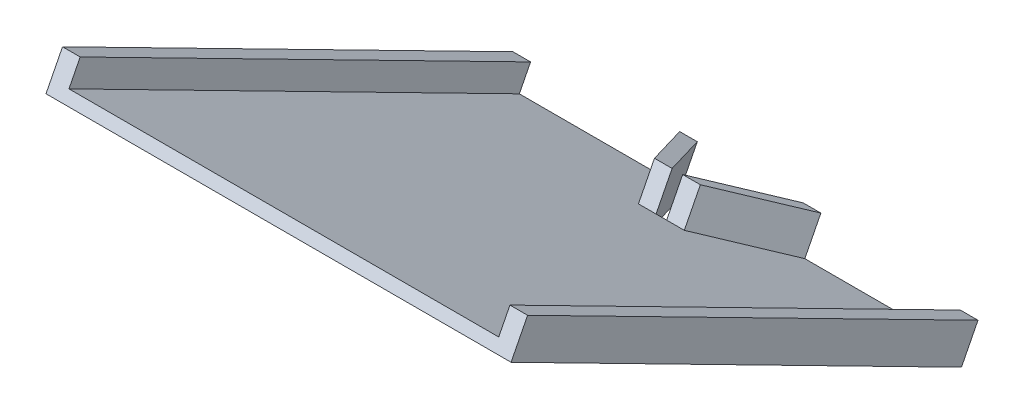
ISO-10303-21;
HEADER;
FILE_DESCRIPTION(('STEP AP214'),'2;1');
FILE_NAME('part.step','',(''),(''),'','','');
FILE_SCHEMA(('AUTOMOTIVE_DESIGN { 1 0 10303 214 1 1 1 1 }'));
ENDSEC;
DATA;
#1=APPLICATION_CONTEXT('core data for automotive mechanical design processes');
#2=APPLICATION_PROTOCOL_DEFINITION('international standard','automotive_design',2000,#1);
#3=PRODUCT_CONTEXT('',#1,'mechanical');
#4=PRODUCT('Part','Part','',(#3));
#5=PRODUCT_RELATED_PRODUCT_CATEGORY('part','',(#4));
#6=PRODUCT_DEFINITION_FORMATION('','',#4);
#7=PRODUCT_DEFINITION_CONTEXT('part definition',#1,'design');
#8=PRODUCT_DEFINITION('design','',#6,#7);
#9=PRODUCT_DEFINITION_SHAPE('','',#8);
#10=(LENGTH_UNIT() NAMED_UNIT(*) SI_UNIT(.MILLI.,.METRE.));
#11=(NAMED_UNIT(*) PLANE_ANGLE_UNIT() SI_UNIT($,.RADIAN.));
#12=(NAMED_UNIT(*) SI_UNIT($,.STERADIAN.) SOLID_ANGLE_UNIT());
#13=UNCERTAINTY_MEASURE_WITH_UNIT(LENGTH_MEASURE(1.E-05),#10,'distance_accuracy_value','');
#14=(GEOMETRIC_REPRESENTATION_CONTEXT(3) GLOBAL_UNCERTAINTY_ASSIGNED_CONTEXT((#13)) GLOBAL_UNIT_ASSIGNED_CONTEXT((#10,
#11,#12)) REPRESENTATION_CONTEXT('',''));
#15=CARTESIAN_POINT('',(0.,0.,0.));
#16=DIRECTION('',(0.,0.,1.));
#17=DIRECTION('',(1.,0.,0.));
#18=AXIS2_PLACEMENT_3D('',#15,#16,#17);
#19=CARTESIAN_POINT('',(1317.1,29.492315950635,-15.027085541379));
#20=DIRECTION('',(0.,-0.891006524188367,0.453990499739548));
#21=DIRECTION('',(0.,-0.453990499739548,-0.891006524188368));
#22=AXIS2_PLACEMENT_3D('',#19,#20,#21);
#23=PLANE('',#22);
#24=DIRECTION('',(0.503592675263439,0.392221102483988,0.769777256215886));
#25=VECTOR('',#24,1.);
#26=CARTESIAN_POINT('',(965.149085517055,-225.91679291682,-516.295685806353));
#27=LINE('',#26,#25);
#28=CARTESIAN_POINT('',(458.6,-620.440483476501,-1290.59202556945));
#29=VERTEX_POINT('',#28);
#30=CARTESIAN_POINT('',(593.6,-515.296283736822,-1084.23491456742));
#31=VERTEX_POINT('',#30);
#32=EDGE_CURVE('E53',#29,#31,#27,.T.);
#33=ORIENTED_EDGE('',*,*,#32,.F.);
#34=DIRECTION('',(-1.,0.,0.));
#35=VECTOR('',#34,1.);
#36=CARTESIAN_POINT('',(1317.1,-620.440483476501,-1290.59202556945));
#37=LINE('',#36,#35);
#38=CARTESIAN_POINT('',(50.,-620.440483476501,-1290.59202556945));
#39=VERTEX_POINT('',#38);
#40=EDGE_CURVE('E174',#29,#39,#37,.T.);
#41=ORIENTED_EDGE('',*,*,#40,.T.);
#42=DIRECTION('',(0.,-0.453990499739547,-0.891006524188367));
#43=VECTOR('',#42,1.);
#44=CARTESIAN_POINT('',(50.,29.492315950635,-15.027085541379));
#45=LINE('',#44,#43);
#46=CARTESIAN_POINT('',(50.,29.492315950635,-15.027085541379));
#47=VERTEX_POINT('',#46);
#48=EDGE_CURVE('E210',#47,#39,#45,.T.);
#49=ORIENTED_EDGE('',*,*,#48,.F.);
#50=DIRECTION('',(-1.,0.,0.));
#51=VECTOR('',#50,1.);
#52=CARTESIAN_POINT('',(1317.1,29.492315950635,-15.027085541379));
#53=LINE('',#52,#51);
#54=CARTESIAN_POINT('',(1267.1,29.492315950635,-15.027085541379));
#55=VERTEX_POINT('',#54);
#56=EDGE_CURVE('E268',#55,#47,#53,.T.);
#57=ORIENTED_EDGE('',*,*,#56,.F.);
#58=DIRECTION('',(0.,-0.453990499739547,-0.891006524188367));
#59=VECTOR('',#58,1.);
#60=CARTESIAN_POINT('',(1267.1,29.492315950635,-15.027085541379));
#61=LINE('',#60,#59);
#62=CARTESIAN_POINT('',(1267.1,-620.440483476501,-1290.59202556945));
#63=VERTEX_POINT('',#62);
#64=EDGE_CURVE('E207',#55,#63,#61,.T.);
#65=ORIENTED_EDGE('',*,*,#64,.T.);
#66=CARTESIAN_POINT('',(858.5,-620.440483476501,-1290.59202556945));
#67=VERTEX_POINT('',#66);
#68=EDGE_CURVE('E276',#63,#67,#37,.T.);
#69=ORIENTED_EDGE('',*,*,#68,.T.);
#70=DIRECTION('',(-0.503592675263439,0.392221102483988,0.769777256215886));
#71=VECTOR('',#70,1.);
#72=CARTESIAN_POINT('',(17.9270016681605,34.2363700967126,-5.71635503560176));
#73=LINE('',#72,#71);
#74=CARTESIAN_POINT('',(723.5,-515.296283736822,-1084.23491456742));
#75=VERTEX_POINT('',#74);
#76=EDGE_CURVE('E175',#67,#75,#73,.T.);
#77=ORIENTED_EDGE('',*,*,#76,.T.);
#78=DIRECTION('',(1.,0.,0.));
#79=VECTOR('',#78,1.);
#80=CARTESIAN_POINT('',(0.,-515.296283736822,-1084.23491456742));
#81=LINE('',#80,#79);
#82=CARTESIAN_POINT('',(673.5,-515.296283736822,-1084.23491456742));
#83=VERTEX_POINT('',#82);
#84=EDGE_CURVE('E178',#83,#75,#81,.T.);
#85=ORIENTED_EDGE('',*,*,#84,.F.);
#86=DIRECTION('',(1.,0.,0.));
#87=VECTOR('',#86,1.);
#88=CARTESIAN_POINT('',(0.,-515.296283736822,-1084.23491456742));
#89=LINE('',#88,#87);
#90=CARTESIAN_POINT('',(643.5,-515.296283736822,-1084.23491456742));
#91=VERTEX_POINT('',#90);
#92=EDGE_CURVE('E239',#91,#83,#89,.T.);
#93=ORIENTED_EDGE('',*,*,#92,.F.);
#94=DIRECTION('',(1.,0.,0.));
#95=VECTOR('',#94,1.);
#96=CARTESIAN_POINT('',(0.,-515.296283736822,-1084.23491456742));
#97=LINE('',#96,#95);
#98=EDGE_CURVE('E49',#31,#91,#97,.T.);
#99=ORIENTED_EDGE('',*,*,#98,.F.);
#100=EDGE_LOOP('',(#33,#41,#49,#57,#65,#69,#77,#85,#93,#99));
#101=FACE_BOUND('',#100,.T.);
#102=ADVANCED_FACE('F34',(#101),#23,.F.);
#103=CARTESIAN_POINT('',(1317.1,0.,0.));
#104=DIRECTION('',(0.,0.891006524188367,-0.453990499739547));
#105=DIRECTION('',(0.,0.453990499739548,0.891006524188368));
#106=AXIS2_PLACEMENT_3D('',#103,#104,#105);
#107=PLANE('',#106);
#108=DIRECTION('',(-0.503592675263439,-0.392221102483988,-0.769777256215886));
#109=VECTOR('',#108,1.);
#110=CARTESIAN_POINT('',(1336.41807976115,-5.11217760122711,-10.0332134661764));
#111=LINE('',#110,#109);
#112=CARTESIAN_POINT('',(643.5,-544.788599687457,-1069.20782902604));
#113=VERTEX_POINT('',#112);
#114=CARTESIAN_POINT('',(508.5,-649.932799427136,-1275.56494002807));
#115=VERTEX_POINT('',#114);
#116=EDGE_CURVE('E257',#113,#115,#111,.T.);
#117=ORIENTED_EDGE('',*,*,#116,.F.);
#118=DIRECTION('',(1.,0.,0.));
#119=VECTOR('',#118,1.);
#120=CARTESIAN_POINT('',(1317.1,-544.788599687457,-1069.20782902604));
#121=LINE('',#120,#119);
#122=CARTESIAN_POINT('',(673.5,-544.788599687457,-1069.20782902604));
#123=VERTEX_POINT('',#122);
#124=EDGE_CURVE('E245',#113,#123,#121,.T.);
#125=ORIENTED_EDGE('',*,*,#124,.T.);
#126=DIRECTION('',(0.503592675263439,-0.392221102483988,-0.769777256215886));
#127=VECTOR('',#126,1.);
#128=CARTESIAN_POINT('',(314.631193611895,-265.285092582189,-520.651309655709));
#129=LINE('',#128,#127);
#130=CARTESIAN_POINT('',(808.5,-649.932799427136,-1275.56494002807));
#131=VERTEX_POINT('',#130);
#132=EDGE_CURVE('E254',#123,#131,#129,.T.);
#133=ORIENTED_EDGE('',*,*,#132,.T.);
#134=DIRECTION('',(-1.,0.,0.));
#135=VECTOR('',#134,1.);
#136=CARTESIAN_POINT('',(1317.1,-649.932799427136,-1275.56494002807));
#137=LINE('',#136,#135);
#138=CARTESIAN_POINT('',(1317.1,-649.932799427136,-1275.56494002807));
#139=VERTEX_POINT('',#138);
#140=EDGE_CURVE('E42',#139,#131,#137,.T.);
#141=ORIENTED_EDGE('',*,*,#140,.F.);
#142=DIRECTION('',(0.,-0.453990499739547,-0.891006524188367));
#143=VECTOR('',#142,1.);
#144=CARTESIAN_POINT('',(1317.1,0.,0.));
#145=LINE('',#144,#143);
#146=CARTESIAN_POINT('',(1317.1,0.,0.));
#147=VERTEX_POINT('',#146);
#148=EDGE_CURVE('E263',#147,#139,#145,.T.);
#149=ORIENTED_EDGE('',*,*,#148,.F.);
#150=DIRECTION('',(-1.,0.,0.));
#151=VECTOR('',#150,1.);
#152=CARTESIAN_POINT('',(1317.1,0.,0.));
#153=LINE('',#152,#151);
#154=CARTESIAN_POINT('',(0.,0.,0.));
#155=VERTEX_POINT('',#154);
#156=EDGE_CURVE('E11',#147,#155,#153,.T.);
#157=ORIENTED_EDGE('',*,*,#156,.T.);
#158=DIRECTION('',(0.,-0.453990499739547,-0.891006524188367));
#159=VECTOR('',#158,1.);
#160=CARTESIAN_POINT('',(0.,0.,0.));
#161=LINE('',#160,#159);
#162=CARTESIAN_POINT('',(0.,-649.932799427136,-1275.56494002807));
#163=VERTEX_POINT('',#162);
#164=EDGE_CURVE('E271',#155,#163,#161,.T.);
#165=ORIENTED_EDGE('',*,*,#164,.T.);
#166=EDGE_CURVE('E278',#115,#163,#137,.T.);
#167=ORIENTED_EDGE('',*,*,#166,.F.);
#168=EDGE_LOOP('',(#117,#125,#133,#141,#149,#157,#165,#167));
#169=FACE_BOUND('',#168,.T.);
#170=ADVANCED_FACE('F288',(#169),#107,.F.);
#171=CARTESIAN_POINT('',(1317.1,-649.932799427136,-1275.56494002807));
#172=DIRECTION('',(0.,0.453990499739548,0.891006524188367));
#173=DIRECTION('',(0.,-0.891006524188367,0.453990499739548));
#174=AXIS2_PLACEMENT_3D('',#171,#172,#173);
#175=PLANE('',#174);
#176=DIRECTION('',(0.,0.891006524188368,-0.453990499739548));
#177=VECTOR('',#176,1.);
#178=CARTESIAN_POINT('',(508.5,-1165.90965638292,-1012.66160005895));
#179=LINE('',#178,#177);
#180=CARTESIAN_POINT('',(508.5,-531.339831057664,-1335.9910755434));
#181=VERTEX_POINT('',#180);
#182=EDGE_CURVE('E243',#115,#181,#179,.T.);
#183=ORIENTED_EDGE('',*,*,#182,.F.);
#184=ORIENTED_EDGE('',*,*,#166,.T.);
#185=DIRECTION('',(0.,0.891006524188367,-0.453990499739548));
#186=VECTOR('',#185,1.);
#187=CARTESIAN_POINT('',(0.,-649.932799427136,-1275.56494002807));
#188=LINE('',#187,#186);
#189=CARTESIAN_POINT('',(0.,-558.070026783315,-1322.37136055121));
#190=VERTEX_POINT('',#189);
#191=EDGE_CURVE('E264',#163,#190,#188,.T.);
#192=ORIENTED_EDGE('',*,*,#191,.T.);
#193=DIRECTION('',(1.,0.,0.));
#194=VECTOR('',#193,1.);
#195=CARTESIAN_POINT('',(0.,-558.070026783315,-1322.37136055121));
#196=LINE('',#195,#194);
#197=CARTESIAN_POINT('',(50.,-558.070026783315,-1322.37136055121));
#198=VERTEX_POINT('',#197);
#199=EDGE_CURVE('E226',#190,#198,#196,.T.);
#200=ORIENTED_EDGE('',*,*,#199,.T.);
#201=DIRECTION('',(0.,-0.891006524188368,0.453990499739547));
#202=VECTOR('',#201,1.);
#203=CARTESIAN_POINT('',(50.,-558.070026783315,-1322.37136055121));
#204=LINE('',#203,#202);
#205=EDGE_CURVE('E232',#198,#39,#204,.T.);
#206=ORIENTED_EDGE('',*,*,#205,.T.);
#207=ORIENTED_EDGE('',*,*,#40,.F.);
#208=DIRECTION('',(0.,-0.891006524188368,0.453990499739547));
#209=VECTOR('',#208,1.);
#210=CARTESIAN_POINT('',(458.6,-531.339831057664,-1335.9910755434));
#211=LINE('',#210,#209);
#212=CARTESIAN_POINT('',(458.6,-531.339831057664,-1335.9910755434));
#213=VERTEX_POINT('',#212);
#214=EDGE_CURVE('E156',#213,#29,#211,.T.);
#215=ORIENTED_EDGE('',*,*,#214,.F.);
#216=DIRECTION('',(-1.,0.,0.));
#217=VECTOR('',#216,1.);
#218=CARTESIAN_POINT('',(0.,-531.339831057664,-1335.9910755434));
#219=LINE('',#218,#217);
#220=EDGE_CURVE('E162',#181,#213,#219,.T.);
#221=ORIENTED_EDGE('',*,*,#220,.F.);
#222=EDGE_LOOP('',(#183,#184,#192,#200,#206,#207,#215,#221));
#223=FACE_BOUND('',#222,.T.);
#224=ADVANCED_FACE('F172',(#223),#175,.F.);
#225=CARTESIAN_POINT('',(1317.1,0.,0.));
#226=DIRECTION('',(0.,-0.453990499739548,-0.891006524188368));
#227=DIRECTION('',(0.,0.891006524188368,-0.453990499739548));
#228=AXIS2_PLACEMENT_3D('',#225,#226,#227);
#229=PLANE('',#228);
#230=DIRECTION('',(0.,-0.891006524188368,0.453990499739548));
#231=VECTOR('',#230,1.);
#232=CARTESIAN_POINT('',(0.,0.,0.));
#233=LINE('',#232,#231);
#234=CARTESIAN_POINT('',(0.,91.8627726438207,-46.8064205231473));
#235=VERTEX_POINT('',#234);
#236=EDGE_CURVE('E259',#235,#155,#233,.T.);
#237=ORIENTED_EDGE('',*,*,#236,.T.);
#238=ORIENTED_EDGE('',*,*,#156,.F.);
#239=DIRECTION('',(0.,-0.891006524188368,0.453990499739548));
#240=VECTOR('',#239,1.);
#241=CARTESIAN_POINT('',(1317.1,0.,0.));
#242=LINE('',#241,#240);
#243=CARTESIAN_POINT('',(1317.1,91.8627726438207,-46.8064205231473));
#244=VERTEX_POINT('',#243);
#245=EDGE_CURVE('E260',#244,#147,#242,.T.);
#246=ORIENTED_EDGE('',*,*,#245,.F.);
#247=DIRECTION('',(-1.,0.,0.));
#248=VECTOR('',#247,1.);
#249=CARTESIAN_POINT('',(1317.1,91.8627726438207,-46.8064205231473));
#250=LINE('',#249,#248);
#251=CARTESIAN_POINT('',(1267.1,91.8627726438207,-46.8064205231473));
#252=VERTEX_POINT('',#251);
#253=EDGE_CURVE('E211',#244,#252,#250,.T.);
#254=ORIENTED_EDGE('',*,*,#253,.T.);
#255=DIRECTION('',(0.,-0.891006524188368,0.453990499739547));
#256=VECTOR('',#255,1.);
#257=CARTESIAN_POINT('',(1267.1,91.8627726438207,-46.8064205231473));
#258=LINE('',#257,#256);
#259=EDGE_CURVE('E203',#252,#55,#258,.T.);
#260=ORIENTED_EDGE('',*,*,#259,.T.);
#261=ORIENTED_EDGE('',*,*,#56,.T.);
#262=DIRECTION('',(0.,-0.891006524188368,0.453990499739547));
#263=VECTOR('',#262,1.);
#264=CARTESIAN_POINT('',(50.,91.8627726438207,-46.8064205231473));
#265=LINE('',#264,#263);
#266=CARTESIAN_POINT('',(50.,91.8627726438207,-46.8064205231473));
#267=VERTEX_POINT('',#266);
#268=EDGE_CURVE('E236',#267,#47,#265,.T.);
#269=ORIENTED_EDGE('',*,*,#268,.F.);
#270=DIRECTION('',(1.,0.,0.));
#271=VECTOR('',#270,1.);
#272=CARTESIAN_POINT('',(0.,91.8627726438207,-46.8064205231473));
#273=LINE('',#272,#271);
#274=EDGE_CURVE('E221',#235,#267,#273,.T.);
#275=ORIENTED_EDGE('',*,*,#274,.F.);
#276=EDGE_LOOP('',(#237,#238,#246,#254,#260,#261,#269,#275));
#277=FACE_BOUND('',#276,.T.);
#278=ADVANCED_FACE('F36',(#277),#229,.F.);
#279=ORIENTED_EDGE('',*,*,#140,.T.);
#280=DIRECTION('',(0.,0.891006524188368,-0.453990499739548));
#281=VECTOR('',#280,1.);
#282=CARTESIAN_POINT('',(808.5,-1165.90965638292,-1012.66160005895));
#283=LINE('',#282,#281);
#284=CARTESIAN_POINT('',(808.5,-531.339831057665,-1335.9910755434));
#285=VERTEX_POINT('',#284);
#286=EDGE_CURVE('E246',#131,#285,#283,.T.);
#287=ORIENTED_EDGE('',*,*,#286,.T.);
#288=DIRECTION('',(-1.,0.,0.));
#289=VECTOR('',#288,1.);
#290=CARTESIAN_POINT('',(0.,-531.339831057664,-1335.9910755434));
#291=LINE('',#290,#289);
#292=CARTESIAN_POINT('',(858.5,-531.339831057664,-1335.9910755434));
#293=VERTEX_POINT('',#292);
#294=EDGE_CURVE('E187',#293,#285,#291,.T.);
#295=ORIENTED_EDGE('',*,*,#294,.F.);
#296=DIRECTION('',(0.,-0.891006524188368,0.453990499739547));
#297=VECTOR('',#296,1.);
#298=CARTESIAN_POINT('',(858.5,-531.339831057664,-1335.9910755434));
#299=LINE('',#298,#297);
#300=EDGE_CURVE('E200',#293,#67,#299,.T.);
#301=ORIENTED_EDGE('',*,*,#300,.T.);
#302=ORIENTED_EDGE('',*,*,#68,.F.);
#303=DIRECTION('',(0.,-0.891006524188368,0.453990499739547));
#304=VECTOR('',#303,1.);
#305=CARTESIAN_POINT('',(1267.1,-558.070026783315,-1322.37136055121));
#306=LINE('',#305,#304);
#307=CARTESIAN_POINT('',(1267.1,-558.070026783315,-1322.37136055121));
#308=VERTEX_POINT('',#307);
#309=EDGE_CURVE('E202',#308,#63,#306,.T.);
#310=ORIENTED_EDGE('',*,*,#309,.F.);
#311=DIRECTION('',(-1.,0.,0.));
#312=VECTOR('',#311,1.);
#313=CARTESIAN_POINT('',(1317.1,-558.070026783315,-1322.37136055121));
#314=LINE('',#313,#312);
#315=CARTESIAN_POINT('',(1317.1,-558.070026783315,-1322.37136055121));
#316=VERTEX_POINT('',#315);
#317=EDGE_CURVE('E214',#316,#308,#314,.T.);
#318=ORIENTED_EDGE('',*,*,#317,.F.);
#319=DIRECTION('',(0.,0.891006524188367,-0.453990499739548));
#320=VECTOR('',#319,1.);
#321=CARTESIAN_POINT('',(1317.1,-649.932799427136,-1275.56494002807));
#322=LINE('',#321,#320);
#323=EDGE_CURVE('E266',#139,#316,#322,.T.);
#324=ORIENTED_EDGE('',*,*,#323,.F.);
#325=EDGE_LOOP('',(#279,#287,#295,#301,#302,#310,#318,#324));
#326=FACE_BOUND('',#325,.T.);
#327=ADVANCED_FACE('F311',(#326),#175,.F.);
#328=CARTESIAN_POINT('',(1317.1,0.,0.));
#329=DIRECTION('',(-1.,0.,0.));
#330=DIRECTION('',(0.,0.,1.));
#331=AXIS2_PLACEMENT_3D('',#328,#329,#330);
#332=PLANE('',#331);
#333=ORIENTED_EDGE('',*,*,#245,.T.);
#334=ORIENTED_EDGE('',*,*,#148,.T.);
#335=ORIENTED_EDGE('',*,*,#323,.T.);
#336=DIRECTION('',(0.,-0.453990499739547,-0.891006524188367));
#337=VECTOR('',#336,1.);
#338=CARTESIAN_POINT('',(1317.1,91.8627726438207,-46.8064205231473));
#339=LINE('',#338,#337);
#340=EDGE_CURVE('E205',#244,#316,#339,.T.);
#341=ORIENTED_EDGE('',*,*,#340,.F.);
#342=EDGE_LOOP('',(#333,#334,#335,#341));
#343=FACE_BOUND('',#342,.T.);
#344=ADVANCED_FACE('F342',(#343),#332,.F.);
#345=CARTESIAN_POINT('',(0.,0.,0.));
#346=DIRECTION('',(-1.,0.,0.));
#347=DIRECTION('',(0.,0.,1.));
#348=AXIS2_PLACEMENT_3D('',#345,#346,#347);
#349=PLANE('',#348);
#350=ORIENTED_EDGE('',*,*,#236,.F.);
#351=DIRECTION('',(0.,-0.453990499739547,-0.891006524188367));
#352=VECTOR('',#351,1.);
#353=CARTESIAN_POINT('',(0.,91.8627726438207,-46.8064205231473));
#354=LINE('',#353,#352);
#355=EDGE_CURVE('E229',#235,#190,#354,.T.);
#356=ORIENTED_EDGE('',*,*,#355,.T.);
#357=ORIENTED_EDGE('',*,*,#191,.F.);
#358=ORIENTED_EDGE('',*,*,#164,.F.);
#359=EDGE_LOOP('',(#350,#356,#357,#358));
#360=FACE_BOUND('',#359,.T.);
#361=ADVANCED_FACE('F291',(#360),#349,.T.);
#362=CARTESIAN_POINT('',(1002.39416694636,-781.242197570543,-257.709204267809));
#363=DIRECTION('',(0.863941211785277,-0.228626290308024,-0.448704359193198));
#364=DIRECTION('',(-0.460911952147298,0.,-0.887445870105758));
#365=AXIS2_PLACEMENT_3D('',#362,#363,#364);
#366=PLANE('',#365);
#367=ORIENTED_EDGE('',*,*,#116,.T.);
#368=ORIENTED_EDGE('',*,*,#182,.T.);
#369=DIRECTION('',(-0.503592675263439,-0.392221102483988,-0.769777256215886));
#370=VECTOR('',#369,1.);
#371=CARTESIAN_POINT('',(1002.39416694636,-146.672372245288,-581.038679752261));
#372=LINE('',#371,#370);
#373=CARTESIAN_POINT('',(643.5,-426.195631317985,-1129.63396454137));
#374=VERTEX_POINT('',#373);
#375=EDGE_CURVE('E168',#374,#181,#372,.T.);
#376=ORIENTED_EDGE('',*,*,#375,.F.);
#377=DIRECTION('',(0.,-0.891006524188368,0.453990499739547));
#378=VECTOR('',#377,1.);
#379=CARTESIAN_POINT('',(643.5,-426.195631317985,-1129.63396454137));
#380=LINE('',#379,#378);
#381=EDGE_CURVE('E180',#374,#91,#380,.T.);
#382=ORIENTED_EDGE('',*,*,#381,.T.);
#383=DIRECTION('',(0.,0.891006524188368,-0.453990499739548));
#384=VECTOR('',#383,1.);
#385=CARTESIAN_POINT('',(643.5,-1060.76545664324,-806.304489056922));
#386=LINE('',#385,#384);
#387=EDGE_CURVE('E242',#113,#91,#386,.T.);
#388=ORIENTED_EDGE('',*,*,#387,.F.);
#389=EDGE_LOOP('',(#367,#368,#376,#382,#388));
#390=FACE_BOUND('',#389,.T.);
#391=ADVANCED_FACE('F336',(#390),#366,.T.);
#392=CARTESIAN_POINT('',(-19.3927192028895,-521.108786524441,252.831361084161));
#393=DIRECTION('',(0.863941211785277,0.228626290308024,0.448704359193198));
#394=DIRECTION('',(0.460911952147298,0.,-0.887445870105758));
#395=AXIS2_PLACEMENT_3D('',#392,#393,#394);
#396=PLANE('',#395);
#397=DIRECTION('',(0.,0.891006524188368,-0.453990499739548));
#398=VECTOR('',#397,1.);
#399=CARTESIAN_POINT('',(673.5,-1060.76545664324,-806.304489056922));
#400=LINE('',#399,#398);
#401=EDGE_CURVE('E248',#123,#83,#400,.T.);
#402=ORIENTED_EDGE('',*,*,#401,.T.);
#403=DIRECTION('',(0.,-0.891006524188368,0.453990499739547));
#404=VECTOR('',#403,1.);
#405=CARTESIAN_POINT('',(673.5,-426.195631317985,-1129.63396454137));
#406=LINE('',#405,#404);
#407=CARTESIAN_POINT('',(673.5,-426.195631317985,-1129.63396454137));
#408=VERTEX_POINT('',#407);
#409=EDGE_CURVE('E198',#408,#83,#406,.T.);
#410=ORIENTED_EDGE('',*,*,#409,.F.);
#411=DIRECTION('',(-0.503592675263439,0.392221102483988,0.769777256215886));
#412=VECTOR('',#411,1.);
#413=CARTESIAN_POINT('',(-19.3927192028895,113.461038800815,-70.4981144002916));
#414=LINE('',#413,#412);
#415=EDGE_CURVE('E190',#285,#408,#414,.T.);
#416=ORIENTED_EDGE('',*,*,#415,.F.);
#417=ORIENTED_EDGE('',*,*,#286,.F.);
#418=ORIENTED_EDGE('',*,*,#132,.F.);
#419=EDGE_LOOP('',(#402,#410,#416,#417,#418));
#420=FACE_BOUND('',#419,.T.);
#421=ADVANCED_FACE('F325',(#420),#396,.F.);
#422=CARTESIAN_POINT('',(0.,-1060.76545664324,-806.304489056922));
#423=DIRECTION('',(0.,0.453990499739548,0.891006524188368));
#424=DIRECTION('',(0.,-0.891006524188368,0.453990499739548));
#425=AXIS2_PLACEMENT_3D('',#422,#423,#424);
#426=PLANE('',#425);
#427=ORIENTED_EDGE('',*,*,#387,.T.);
#428=ORIENTED_EDGE('',*,*,#92,.T.);
#429=ORIENTED_EDGE('',*,*,#401,.F.);
#430=ORIENTED_EDGE('',*,*,#124,.F.);
#431=EDGE_LOOP('',(#427,#428,#429,#430));
#432=FACE_BOUND('',#431,.T.);
#433=ADVANCED_FACE('F328',(#432),#426,.F.);
#434=CARTESIAN_POINT('',(50.,91.8627726438207,-46.8064205231473));
#435=DIRECTION('',(-1.,0.,0.));
#436=DIRECTION('',(0.,0.,1.));
#437=AXIS2_PLACEMENT_3D('',#434,#435,#436);
#438=PLANE('',#437);
#439=ORIENTED_EDGE('',*,*,#48,.T.);
#440=ORIENTED_EDGE('',*,*,#205,.F.);
#441=DIRECTION('',(0.,-0.453990499739547,-0.891006524188367));
#442=VECTOR('',#441,1.);
#443=CARTESIAN_POINT('',(50.,91.8627726438207,-46.8064205231473));
#444=LINE('',#443,#442);
#445=EDGE_CURVE('E224',#267,#198,#444,.T.);
#446=ORIENTED_EDGE('',*,*,#445,.F.);
#447=ORIENTED_EDGE('',*,*,#268,.T.);
#448=EDGE_LOOP('',(#439,#440,#446,#447));
#449=FACE_BOUND('',#448,.T.);
#450=ADVANCED_FACE('F300',(#449),#438,.F.);
#451=CARTESIAN_POINT('',(0.,91.8627726438207,-46.8064205231473));
#452=DIRECTION('',(0.,0.891006524188368,-0.453990499739547));
#453=DIRECTION('',(0.,0.453990499739547,0.891006524188368));
#454=AXIS2_PLACEMENT_3D('',#451,#452,#453);
#455=PLANE('',#454);
#456=ORIENTED_EDGE('',*,*,#274,.T.);
#457=ORIENTED_EDGE('',*,*,#445,.T.);
#458=ORIENTED_EDGE('',*,*,#199,.F.);
#459=ORIENTED_EDGE('',*,*,#355,.F.);
#460=EDGE_LOOP('',(#456,#457,#458,#459));
#461=FACE_BOUND('',#460,.T.);
#462=ADVANCED_FACE('F295',(#461),#455,.T.);
#463=CARTESIAN_POINT('',(1267.1,91.8627726438207,-46.8064205231473));
#464=DIRECTION('',(-1.,0.,0.));
#465=DIRECTION('',(0.,0.,1.));
#466=AXIS2_PLACEMENT_3D('',#463,#464,#465);
#467=PLANE('',#466);
#468=ORIENTED_EDGE('',*,*,#64,.F.);
#469=ORIENTED_EDGE('',*,*,#259,.F.);
#470=DIRECTION('',(0.,-0.453990499739547,-0.891006524188367));
#471=VECTOR('',#470,1.);
#472=CARTESIAN_POINT('',(1267.1,91.8627726438207,-46.8064205231473));
#473=LINE('',#472,#471);
#474=EDGE_CURVE('E216',#252,#308,#473,.T.);
#475=ORIENTED_EDGE('',*,*,#474,.T.);
#476=ORIENTED_EDGE('',*,*,#309,.T.);
#477=EDGE_LOOP('',(#468,#469,#475,#476));
#478=FACE_BOUND('',#477,.T.);
#479=ADVANCED_FACE('F308',(#478),#467,.T.);
#480=CARTESIAN_POINT('',(0.,91.8627726438207,-46.8064205231473));
#481=DIRECTION('',(0.,-0.891006524188368,0.453990499739547));
#482=DIRECTION('',(0.,-0.453990499739547,-0.891006524188368));
#483=AXIS2_PLACEMENT_3D('',#480,#481,#482);
#484=PLANE('',#483);
#485=ORIENTED_EDGE('',*,*,#253,.F.);
#486=ORIENTED_EDGE('',*,*,#340,.T.);
#487=ORIENTED_EDGE('',*,*,#317,.T.);
#488=ORIENTED_EDGE('',*,*,#474,.F.);
#489=EDGE_LOOP('',(#485,#486,#487,#488));
#490=FACE_BOUND('',#489,.T.);
#491=ADVANCED_FACE('F344',(#490),#484,.F.);
#492=CARTESIAN_POINT('',(17.9270016681605,123.337022515549,-51.1154050095565));
#493=DIRECTION('',(0.863941211785276,0.228626290308024,0.448704359193198));
#494=DIRECTION('',(0.460911952147299,0.,-0.887445870105758));
#495=AXIS2_PLACEMENT_3D('',#492,#493,#494);
#496=PLANE('',#495);
#497=ORIENTED_EDGE('',*,*,#76,.F.);
#498=ORIENTED_EDGE('',*,*,#300,.F.);
#499=DIRECTION('',(-0.503592675263439,0.392221102483988,0.769777256215886));
#500=VECTOR('',#499,1.);
#501=CARTESIAN_POINT('',(17.9270016681605,123.337022515549,-51.1154050095565));
#502=LINE('',#501,#500);
#503=CARTESIAN_POINT('',(723.5,-426.195631317985,-1129.63396454137));
#504=VERTEX_POINT('',#503);
#505=EDGE_CURVE('E184',#293,#504,#502,.T.);
#506=ORIENTED_EDGE('',*,*,#505,.T.);
#507=DIRECTION('',(0.,-0.891006524188368,0.453990499739547));
#508=VECTOR('',#507,1.);
#509=CARTESIAN_POINT('',(723.5,-426.195631317985,-1129.63396454137));
#510=LINE('',#509,#508);
#511=EDGE_CURVE('E193',#504,#75,#510,.T.);
#512=ORIENTED_EDGE('',*,*,#511,.T.);
#513=EDGE_LOOP('',(#497,#498,#506,#512));
#514=FACE_BOUND('',#513,.T.);
#515=ADVANCED_FACE('F316',(#514),#496,.T.);
#516=CARTESIAN_POINT('',(0.,-426.195631317985,-1129.63396454137));
#517=DIRECTION('',(0.,-0.453990499739547,-0.891006524188368));
#518=DIRECTION('',(0.,0.891006524188368,-0.453990499739547));
#519=AXIS2_PLACEMENT_3D('',#516,#517,#518);
#520=PLANE('',#519);
#521=ORIENTED_EDGE('',*,*,#84,.T.);
#522=ORIENTED_EDGE('',*,*,#511,.F.);
#523=DIRECTION('',(1.,0.,0.));
#524=VECTOR('',#523,1.);
#525=CARTESIAN_POINT('',(0.,-426.195631317985,-1129.63396454137));
#526=LINE('',#525,#524);
#527=EDGE_CURVE('E192',#408,#504,#526,.T.);
#528=ORIENTED_EDGE('',*,*,#527,.F.);
#529=ORIENTED_EDGE('',*,*,#409,.T.);
#530=EDGE_LOOP('',(#521,#522,#528,#529));
#531=FACE_BOUND('',#530,.T.);
#532=ADVANCED_FACE('F321',(#531),#520,.F.);
#533=CARTESIAN_POINT('',(0.,118.592968369472,-60.4261355153338));
#534=DIRECTION('',(0.,0.891006524188368,-0.453990499739547));
#535=DIRECTION('',(0.,0.453990499739547,0.891006524188368));
#536=AXIS2_PLACEMENT_3D('',#533,#534,#535);
#537=PLANE('',#536);
#538=ORIENTED_EDGE('',*,*,#505,.F.);
#539=ORIENTED_EDGE('',*,*,#294,.T.);
#540=ORIENTED_EDGE('',*,*,#415,.T.);
#541=ORIENTED_EDGE('',*,*,#527,.T.);
#542=EDGE_LOOP('',(#538,#539,#540,#541));
#543=FACE_BOUND('',#542,.T.);
#544=ADVANCED_FACE('F485',(#543),#537,.T.);
#545=CARTESIAN_POINT('',(965.149085517055,-136.816140497983,-561.694735780308));
#546=DIRECTION('',(0.863941211785276,-0.228626290308024,-0.448704359193198));
#547=DIRECTION('',(-0.460911952147299,0.,-0.887445870105758));
#548=AXIS2_PLACEMENT_3D('',#545,#546,#547);
#549=PLANE('',#548);
#550=ORIENTED_EDGE('',*,*,#32,.T.);
#551=DIRECTION('',(0.,-0.891006524188368,0.453990499739547));
#552=VECTOR('',#551,1.);
#553=CARTESIAN_POINT('',(593.6,-426.195631317985,-1129.63396454137));
#554=LINE('',#553,#552);
#555=CARTESIAN_POINT('',(593.6,-426.195631317985,-1129.63396454137));
#556=VERTEX_POINT('',#555);
#557=EDGE_CURVE('E158',#556,#31,#554,.T.);
#558=ORIENTED_EDGE('',*,*,#557,.F.);
#559=DIRECTION('',(0.503592675263439,0.392221102483988,0.769777256215886));
#560=VECTOR('',#559,1.);
#561=CARTESIAN_POINT('',(965.149085517055,-136.816140497983,-561.694735780308));
#562=LINE('',#561,#560);
#563=EDGE_CURVE('E152',#213,#556,#562,.T.);
#564=ORIENTED_EDGE('',*,*,#563,.F.);
#565=ORIENTED_EDGE('',*,*,#214,.T.);
#566=EDGE_LOOP('',(#550,#558,#564,#565));
#567=FACE_BOUND('',#566,.T.);
#568=ADVANCED_FACE('F154',(#567),#549,.F.);
#569=CARTESIAN_POINT('',(0.,-426.195631317985,-1129.63396454137));
#570=DIRECTION('',(0.,-0.453990499739547,-0.891006524188368));
#571=DIRECTION('',(0.,0.891006524188368,-0.453990499739547));
#572=AXIS2_PLACEMENT_3D('',#569,#570,#571);
#573=PLANE('',#572);
#574=ORIENTED_EDGE('',*,*,#98,.T.);
#575=ORIENTED_EDGE('',*,*,#381,.F.);
#576=DIRECTION('',(1.,0.,0.));
#577=VECTOR('',#576,1.);
#578=CARTESIAN_POINT('',(0.,-426.195631317985,-1129.63396454137));
#579=LINE('',#578,#577);
#580=EDGE_CURVE('E161',#556,#374,#579,.T.);
#581=ORIENTED_EDGE('',*,*,#580,.F.);
#582=ORIENTED_EDGE('',*,*,#557,.T.);
#583=EDGE_LOOP('',(#574,#575,#581,#582));
#584=FACE_BOUND('',#583,.T.);
#585=ADVANCED_FACE('F333',(#584),#573,.F.);
#586=CARTESIAN_POINT('',(0.,118.592968369472,-60.4261355153338));
#587=DIRECTION('',(0.,0.891006524188368,-0.453990499739547));
#588=DIRECTION('',(0.,0.453990499739547,0.891006524188368));
#589=AXIS2_PLACEMENT_3D('',#586,#587,#588);
#590=PLANE('',#589);
#591=ORIENTED_EDGE('',*,*,#220,.T.);
#592=ORIENTED_EDGE('',*,*,#563,.T.);
#593=ORIENTED_EDGE('',*,*,#580,.T.);
#594=ORIENTED_EDGE('',*,*,#375,.T.);
#595=EDGE_LOOP('',(#591,#592,#593,#594));
#596=FACE_BOUND('',#595,.T.);
#597=ADVANCED_FACE('F166',(#596),#590,.T.);
#598=CLOSED_SHELL('',(#102,#170,#224,#278,#327,#344,#361,#391,#421,#433,#450,#462,#479,#491,
#515,#532,#544,#568,#585,#597));
#599=MANIFOLD_SOLID_BREP('B2',#598);
#600=ADVANCED_BREP_SHAPE_REPRESENTATION('',(#18,#599),#14);
#601=SHAPE_DEFINITION_REPRESENTATION(#9,#600);
ENDSEC;
END-ISO-10303-21;
